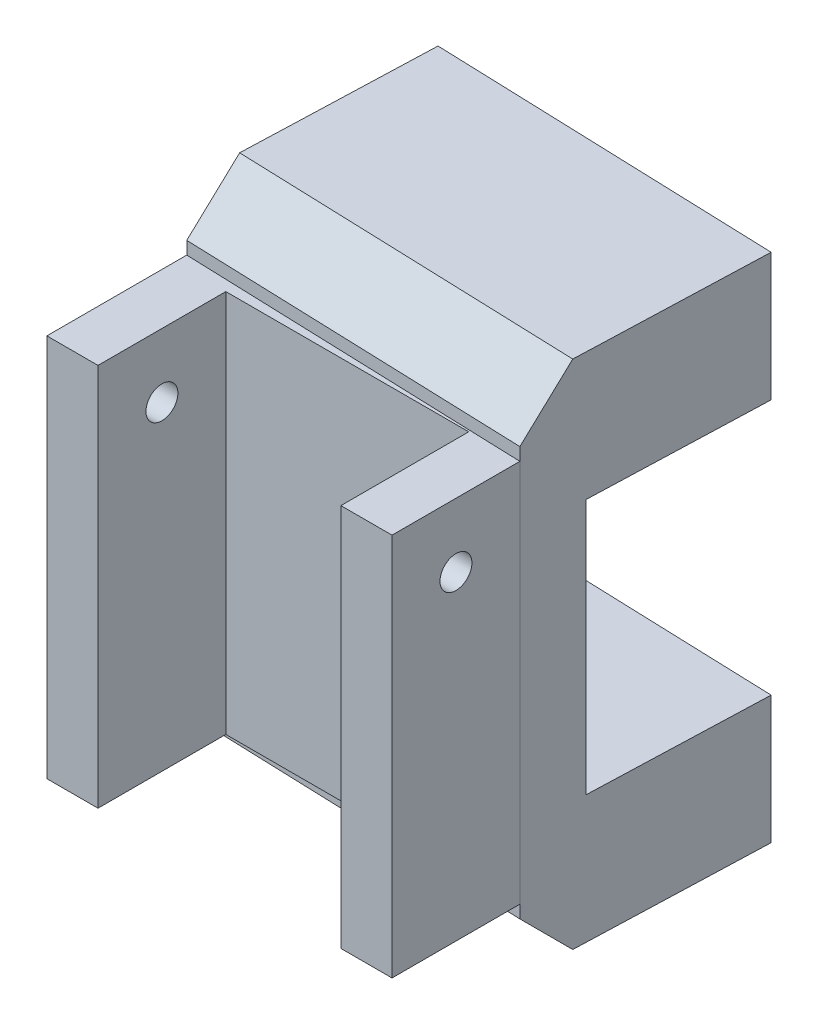
ISO-10303-21;
HEADER;
FILE_DESCRIPTION(('STEP AP214'),'2;1');
FILE_NAME('part.step','',(''),(''),'','','');
FILE_SCHEMA(('AUTOMOTIVE_DESIGN { 1 0 10303 214 1 1 1 1 }'));
ENDSEC;
DATA;
#1=APPLICATION_CONTEXT('core data for automotive mechanical design processes');
#2=APPLICATION_PROTOCOL_DEFINITION('international standard','automotive_design',2000,#1);
#3=PRODUCT_CONTEXT('',#1,'mechanical');
#4=PRODUCT('Part','Part','',(#3));
#5=PRODUCT_RELATED_PRODUCT_CATEGORY('part','',(#4));
#6=PRODUCT_DEFINITION_FORMATION('','',#4);
#7=PRODUCT_DEFINITION_CONTEXT('part definition',#1,'design');
#8=PRODUCT_DEFINITION('design','',#6,#7);
#9=PRODUCT_DEFINITION_SHAPE('','',#8);
#10=(LENGTH_UNIT() NAMED_UNIT(*) SI_UNIT(.MILLI.,.METRE.));
#11=(NAMED_UNIT(*) PLANE_ANGLE_UNIT() SI_UNIT($,.RADIAN.));
#12=(NAMED_UNIT(*) SI_UNIT($,.STERADIAN.) SOLID_ANGLE_UNIT());
#13=UNCERTAINTY_MEASURE_WITH_UNIT(LENGTH_MEASURE(1.E-05),#10,'distance_accuracy_value','');
#14=(GEOMETRIC_REPRESENTATION_CONTEXT(3) GLOBAL_UNCERTAINTY_ASSIGNED_CONTEXT((#13)) GLOBAL_UNIT_ASSIGNED_CONTEXT((#10,
#11,#12)) REPRESENTATION_CONTEXT('',''));
#15=CARTESIAN_POINT('',(0.,0.,0.));
#16=DIRECTION('',(0.,0.,1.));
#17=DIRECTION('',(1.,0.,0.));
#18=AXIS2_PLACEMENT_3D('',#15,#16,#17);
#19=CARTESIAN_POINT('',(8.68337344313627,9.525,-6.35));
#20=DIRECTION('',(-0.0348994967024937,0.,0.999390827019096));
#21=DIRECTION('',(0.999390827019096,0.,0.0348994967024937));
#22=AXIS2_PLACEMENT_3D('',#19,#20,#21);
#23=PLANE('',#22);
#24=DIRECTION('',(0.,-1.,0.));
#25=VECTOR('',#24,1.);
#26=CARTESIAN_POINT('',(8.68337344313627,9.525,-6.35));
#27=LINE('',#26,#25);
#28=CARTESIAN_POINT('',(8.68337344313627,6.35,-6.35));
#29=VERTEX_POINT('',#28);
#30=CARTESIAN_POINT('',(8.68337344313628,-6.35,-6.35));
#31=VERTEX_POINT('',#30);
#32=EDGE_CURVE('E603',#29,#31,#27,.T.);
#33=ORIENTED_EDGE('',*,*,#32,.T.);
#34=DIRECTION('',(-0.999390827019096,0.,-0.0348994967024937));
#35=VECTOR('',#34,1.);
#36=CARTESIAN_POINT('',(8.68337344313627,-6.35,-6.35));
#37=LINE('',#36,#35);
#38=CARTESIAN_POINT('',(-8.46162655686373,-6.35,-6.94871659293589));
#39=VERTEX_POINT('',#38);
#40=EDGE_CURVE('E512',#31,#39,#37,.T.);
#41=ORIENTED_EDGE('',*,*,#40,.T.);
#42=DIRECTION('',(0.,-1.,0.));
#43=VECTOR('',#42,1.);
#44=CARTESIAN_POINT('',(-8.46162655686373,9.525,-6.94871659293589));
#45=LINE('',#44,#43);
#46=CARTESIAN_POINT('',(-8.46162655686373,6.35,-6.94871659293589));
#47=VERTEX_POINT('',#46);
#48=EDGE_CURVE('E628',#47,#39,#45,.T.);
#49=ORIENTED_EDGE('',*,*,#48,.F.);
#50=DIRECTION('',(0.999390827019096,0.,0.0348994967024937));
#51=VECTOR('',#50,1.);
#52=CARTESIAN_POINT('',(8.68337344313627,6.35,-6.35));
#53=LINE('',#52,#51);
#54=EDGE_CURVE('E561',#47,#29,#53,.T.);
#55=ORIENTED_EDGE('',*,*,#54,.T.);
#56=EDGE_LOOP('',(#33,#41,#49,#55));
#57=FACE_BOUND('',#56,.T.);
#58=ADVANCED_FACE('F372',(#57),#23,.F.);
#59=CARTESIAN_POINT('',(-8.46162655686373,9.525,-6.94871659293589));
#60=DIRECTION('',(0.999390827019096,0.,0.0348994967024924));
#61=DIRECTION('',(0.0348994967024924,0.,-0.999390827019096));
#62=AXIS2_PLACEMENT_3D('',#59,#60,#61);
#63=PLANE('',#62);
#64=DIRECTION('',(0.,1.,0.));
#65=VECTOR('',#64,1.);
#66=CARTESIAN_POINT('',(-8.5725,6.35,-3.7737165929359));
#67=LINE('',#66,#65);
#68=CARTESIAN_POINT('',(-8.5725,9.525,-3.7737165929359));
#69=VERTEX_POINT('',#68);
#70=CARTESIAN_POINT('',(-8.5725,10.16,-3.7737165929359));
#71=VERTEX_POINT('',#70);
#72=EDGE_CURVE('E538',#69,#71,#67,.T.);
#73=ORIENTED_EDGE('',*,*,#72,.T.);
#74=DIRECTION('',(-0.0246776707783299,-0.707106781186548,0.706676030840834));
#75=VECTOR('',#74,1.);
#76=CARTESIAN_POINT('',(-8.48385527837567,12.7,-6.31216929356442));
#77=LINE('',#76,#75);
#78=CARTESIAN_POINT('',(-8.48385527837567,12.7,-6.3121692935644));
#79=VERTEX_POINT('',#78);
#80=EDGE_CURVE('E649',#71,#79,#77,.F.);
#81=ORIENTED_EDGE('',*,*,#80,.T.);
#82=DIRECTION('',(0.0348994967024924,0.,-0.999390827019096));
#83=VECTOR('',#82,1.);
#84=CARTESIAN_POINT('',(-8.15137003117857,12.7,-15.8333010451357));
#85=LINE('',#84,#83);
#86=CARTESIAN_POINT('',(-8.15137003117857,12.7,-15.8333010451357));
#87=VERTEX_POINT('',#86);
#88=EDGE_CURVE('E547',#79,#87,#85,.T.);
#89=ORIENTED_EDGE('',*,*,#88,.T.);
#90=DIRECTION('',(0.,-1.,0.));
#91=VECTOR('',#90,1.);
#92=CARTESIAN_POINT('',(-8.15137003117857,12.7,-15.8333010451357));
#93=LINE('',#92,#91);
#94=CARTESIAN_POINT('',(-8.15137003117857,6.35,-15.8333010451357));
#95=VERTEX_POINT('',#94);
#96=EDGE_CURVE('E545',#87,#95,#93,.T.);
#97=ORIENTED_EDGE('',*,*,#96,.T.);
#98=DIRECTION('',(-0.0348994967024924,0.,0.999390827019096));
#99=VECTOR('',#98,1.);
#100=CARTESIAN_POINT('',(-8.15137003117857,6.35,-15.8333010451357));
#101=LINE('',#100,#99);
#102=EDGE_CURVE('E541',#95,#47,#101,.T.);
#103=ORIENTED_EDGE('',*,*,#102,.T.);
#104=ORIENTED_EDGE('',*,*,#48,.T.);
#105=DIRECTION('',(0.0348994967024924,0.,-0.999390827019096));
#106=VECTOR('',#105,1.);
#107=CARTESIAN_POINT('',(-8.15137003117857,-6.35,-15.8333010451357));
#108=LINE('',#107,#106);
#109=CARTESIAN_POINT('',(-8.15137003117857,-6.35,-15.8333010451357));
#110=VERTEX_POINT('',#109);
#111=EDGE_CURVE('E534',#39,#110,#108,.T.);
#112=ORIENTED_EDGE('',*,*,#111,.T.);
#113=DIRECTION('',(0.,-1.,0.));
#114=VECTOR('',#113,1.);
#115=CARTESIAN_POINT('',(-8.15137003117857,-6.35,-15.8333010451357));
#116=LINE('',#115,#114);
#117=CARTESIAN_POINT('',(-8.15137003117857,-12.7,-15.8333010451357));
#118=VERTEX_POINT('',#117);
#119=EDGE_CURVE('E503',#110,#118,#116,.T.);
#120=ORIENTED_EDGE('',*,*,#119,.T.);
#121=DIRECTION('',(-0.0348994967024924,0.,0.999390827019096));
#122=VECTOR('',#121,1.);
#123=CARTESIAN_POINT('',(-8.15137003117857,-12.7,-15.8333010451357));
#124=LINE('',#123,#122);
#125=CARTESIAN_POINT('',(-8.48385527837567,-12.7,-6.31216929356441));
#126=VERTEX_POINT('',#125);
#127=EDGE_CURVE('E740',#118,#126,#124,.T.);
#128=ORIENTED_EDGE('',*,*,#127,.T.);
#129=DIRECTION('',(0.0246776707783299,-0.707106781186546,-0.706676030840836));
#130=VECTOR('',#129,1.);
#131=CARTESIAN_POINT('',(-8.5725,-10.16,-3.77371659293591));
#132=LINE('',#131,#130);
#133=CARTESIAN_POINT('',(-8.5725,-10.16,-3.7737165929359));
#134=VERTEX_POINT('',#133);
#135=EDGE_CURVE('E386',#126,#134,#132,.F.);
#136=ORIENTED_EDGE('',*,*,#135,.T.);
#137=DIRECTION('',(0.,1.,0.));
#138=VECTOR('',#137,1.);
#139=CARTESIAN_POINT('',(-8.5725,-9.525,-3.7737165929359));
#140=LINE('',#139,#138);
#141=CARTESIAN_POINT('',(-8.5725,-9.525,-3.77371659293589));
#142=VERTEX_POINT('',#141);
#143=EDGE_CURVE('E532',#134,#142,#140,.T.);
#144=ORIENTED_EDGE('',*,*,#143,.T.);
#145=DIRECTION('',(0.,-1.,0.));
#146=VECTOR('',#145,1.);
#147=CARTESIAN_POINT('',(-8.5725,9.525,-3.77371659293589));
#148=LINE('',#147,#146);
#149=EDGE_CURVE('E625',#69,#142,#148,.T.);
#150=ORIENTED_EDGE('',*,*,#149,.F.);
#151=EDGE_LOOP('',(#73,#81,#89,#97,#103,#104,#112,#120,#128,#136,#144,#150));
#152=FACE_BOUND('',#151,.T.);
#153=ADVANCED_FACE('F714',(#152),#63,.F.);
#154=CARTESIAN_POINT('',(-8.5725,9.525,-3.77371659293589));
#155=DIRECTION('',(1.,0.,0.));
#156=DIRECTION('',(0.,0.,-1.));
#157=AXIS2_PLACEMENT_3D('',#154,#155,#156);
#158=PLANE('',#157);
#159=CARTESIAN_POINT('',(-8.5725,6.35,0.));
#160=DIRECTION('',(-1.,0.,0.));
#161=DIRECTION('',(0.,0.,1.));
#162=AXIS2_PLACEMENT_3D('',#159,#160,#161);
#163=CIRCLE('',#162,0.79375);
#164=CARTESIAN_POINT('',(-8.5725,6.35,0.79375));
#165=VERTEX_POINT('',#164);
#166=EDGE_CURVE('E563',#165,#165,#163,.T.);
#167=ORIENTED_EDGE('',*,*,#166,.F.);
#168=EDGE_LOOP('',(#167));
#169=FACE_BOUND('',#168,.T.);
#170=DIRECTION('',(0.,0.,1.));
#171=VECTOR('',#170,1.);
#172=CARTESIAN_POINT('',(-8.5725,-9.525,-3.77371659293589));
#173=LINE('',#172,#171);
#174=CARTESIAN_POINT('',(-8.5725,-9.525,3.175));
#175=VERTEX_POINT('',#174);
#176=EDGE_CURVE('E573',#142,#175,#173,.T.);
#177=ORIENTED_EDGE('',*,*,#176,.T.);
#178=DIRECTION('',(0.,-1.,0.));
#179=VECTOR('',#178,1.);
#180=CARTESIAN_POINT('',(-8.5725,9.525,3.175));
#181=LINE('',#180,#179);
#182=CARTESIAN_POINT('',(-8.5725,9.525,3.175));
#183=VERTEX_POINT('',#182);
#184=EDGE_CURVE('E622',#183,#175,#181,.T.);
#185=ORIENTED_EDGE('',*,*,#184,.F.);
#186=DIRECTION('',(0.,0.,1.));
#187=VECTOR('',#186,1.);
#188=CARTESIAN_POINT('',(-8.5725,9.525,-3.77371659293589));
#189=LINE('',#188,#187);
#190=EDGE_CURVE('E588',#69,#183,#189,.T.);
#191=ORIENTED_EDGE('',*,*,#190,.F.);
#192=ORIENTED_EDGE('',*,*,#149,.T.);
#193=EDGE_LOOP('',(#177,#185,#191,#192));
#194=FACE_BOUND('',#193,.T.);
#195=ADVANCED_FACE('F685',(#169,#194),#158,.F.);
#196=CARTESIAN_POINT('',(-8.5725,9.525,3.175));
#197=DIRECTION('',(0.,0.,-1.));
#198=DIRECTION('',(-1.,0.,0.));
#199=AXIS2_PLACEMENT_3D('',#196,#197,#198);
#200=PLANE('',#199);
#201=DIRECTION('',(1.,0.,0.));
#202=VECTOR('',#201,1.);
#203=CARTESIAN_POINT('',(-8.5725,-9.525,3.175));
#204=LINE('',#203,#202);
#205=CARTESIAN_POINT('',(-6.0325,-9.525,3.175));
#206=VERTEX_POINT('',#205);
#207=EDGE_CURVE('E575',#175,#206,#204,.T.);
#208=ORIENTED_EDGE('',*,*,#207,.T.);
#209=DIRECTION('',(0.,-1.,0.));
#210=VECTOR('',#209,1.);
#211=CARTESIAN_POINT('',(-6.0325,9.525,3.175));
#212=LINE('',#211,#210);
#213=CARTESIAN_POINT('',(-6.0325,9.525,3.175));
#214=VERTEX_POINT('',#213);
#215=EDGE_CURVE('E619',#214,#206,#212,.T.);
#216=ORIENTED_EDGE('',*,*,#215,.F.);
#217=DIRECTION('',(1.,0.,0.));
#218=VECTOR('',#217,1.);
#219=CARTESIAN_POINT('',(-8.5725,9.525,3.175));
#220=LINE('',#219,#218);
#221=EDGE_CURVE('E590',#183,#214,#220,.T.);
#222=ORIENTED_EDGE('',*,*,#221,.F.);
#223=ORIENTED_EDGE('',*,*,#184,.T.);
#224=EDGE_LOOP('',(#208,#216,#222,#223));
#225=FACE_BOUND('',#224,.T.);
#226=ADVANCED_FACE('F689',(#225),#200,.F.);
#227=CARTESIAN_POINT('',(-6.0325,9.525,3.175));
#228=DIRECTION('',(-1.,0.,0.));
#229=DIRECTION('',(0.,0.,1.));
#230=AXIS2_PLACEMENT_3D('',#227,#228,#229);
#231=PLANE('',#230);
#232=CARTESIAN_POINT('',(-6.0325,6.35,0.));
#233=DIRECTION('',(-1.,0.,0.));
#234=DIRECTION('',(0.,0.,1.));
#235=AXIS2_PLACEMENT_3D('',#232,#233,#234);
#236=CIRCLE('',#235,0.79375);
#237=CARTESIAN_POINT('',(-6.0325,6.35,0.793750000000001));
#238=VERTEX_POINT('',#237);
#239=EDGE_CURVE('E570',#238,#238,#236,.T.);
#240=ORIENTED_EDGE('',*,*,#239,.T.);
#241=EDGE_LOOP('',(#240));
#242=FACE_BOUND('',#241,.T.);
#243=DIRECTION('',(0.,0.,-1.));
#244=VECTOR('',#243,1.);
#245=CARTESIAN_POINT('',(-6.0325,-9.525,3.175));
#246=LINE('',#245,#244);
#247=CARTESIAN_POINT('',(-6.0325,-9.525,-3.175));
#248=VERTEX_POINT('',#247);
#249=EDGE_CURVE('E577',#206,#248,#246,.T.);
#250=ORIENTED_EDGE('',*,*,#249,.T.);
#251=DIRECTION('',(0.,-1.,0.));
#252=VECTOR('',#251,1.);
#253=CARTESIAN_POINT('',(-6.0325,9.525,-3.175));
#254=LINE('',#253,#252);
#255=CARTESIAN_POINT('',(-6.0325,9.525,-3.175));
#256=VERTEX_POINT('',#255);
#257=EDGE_CURVE('E616',#256,#248,#254,.T.);
#258=ORIENTED_EDGE('',*,*,#257,.F.);
#259=DIRECTION('',(0.,0.,-1.));
#260=VECTOR('',#259,1.);
#261=CARTESIAN_POINT('',(-6.0325,9.525,3.175));
#262=LINE('',#261,#260);
#263=EDGE_CURVE('E592',#214,#256,#262,.T.);
#264=ORIENTED_EDGE('',*,*,#263,.F.);
#265=ORIENTED_EDGE('',*,*,#215,.T.);
#266=EDGE_LOOP('',(#250,#258,#264,#265));
#267=FACE_BOUND('',#266,.T.);
#268=ADVANCED_FACE('F696',(#242,#267),#231,.F.);
#269=CARTESIAN_POINT('',(-6.0325,9.525,-3.175));
#270=DIRECTION('',(0.,0.,-1.));
#271=DIRECTION('',(-1.,0.,0.));
#272=AXIS2_PLACEMENT_3D('',#269,#270,#271);
#273=PLANE('',#272);
#274=DIRECTION('',(1.,0.,0.));
#275=VECTOR('',#274,1.);
#276=CARTESIAN_POINT('',(-6.0325,-9.525,-3.175));
#277=LINE('',#276,#275);
#278=CARTESIAN_POINT('',(6.0325,-9.525,-3.175));
#279=VERTEX_POINT('',#278);
#280=EDGE_CURVE('E579',#248,#279,#277,.T.);
#281=ORIENTED_EDGE('',*,*,#280,.T.);
#282=DIRECTION('',(0.,-1.,0.));
#283=VECTOR('',#282,1.);
#284=CARTESIAN_POINT('',(6.0325,9.525,-3.175));
#285=LINE('',#284,#283);
#286=CARTESIAN_POINT('',(6.0325,9.525,-3.175));
#287=VERTEX_POINT('',#286);
#288=EDGE_CURVE('E613',#287,#279,#285,.T.);
#289=ORIENTED_EDGE('',*,*,#288,.F.);
#290=DIRECTION('',(1.,0.,0.));
#291=VECTOR('',#290,1.);
#292=CARTESIAN_POINT('',(-6.0325,9.525,-3.175));
#293=LINE('',#292,#291);
#294=EDGE_CURVE('E594',#256,#287,#293,.T.);
#295=ORIENTED_EDGE('',*,*,#294,.F.);
#296=ORIENTED_EDGE('',*,*,#257,.T.);
#297=EDGE_LOOP('',(#281,#289,#295,#296));
#298=FACE_BOUND('',#297,.T.);
#299=ADVANCED_FACE('F699',(#298),#273,.F.);
#300=CARTESIAN_POINT('',(6.0325,9.525,-3.175));
#301=DIRECTION('',(1.,0.,0.));
#302=DIRECTION('',(0.,0.,-1.));
#303=AXIS2_PLACEMENT_3D('',#300,#301,#302);
#304=PLANE('',#303);
#305=CARTESIAN_POINT('',(6.0325,6.35,0.));
#306=DIRECTION('',(1.,0.,0.));
#307=DIRECTION('',(0.,0.,-1.));
#308=AXIS2_PLACEMENT_3D('',#305,#306,#307);
#309=CIRCLE('',#308,0.79375);
#310=CARTESIAN_POINT('',(6.0325,6.35,0.793750000000004));
#311=VERTEX_POINT('',#310);
#312=EDGE_CURVE('E567',#311,#311,#309,.T.);
#313=ORIENTED_EDGE('',*,*,#312,.T.);
#314=EDGE_LOOP('',(#313));
#315=FACE_BOUND('',#314,.T.);
#316=DIRECTION('',(0.,0.,1.));
#317=VECTOR('',#316,1.);
#318=CARTESIAN_POINT('',(6.0325,-9.525,-3.175));
#319=LINE('',#318,#317);
#320=CARTESIAN_POINT('',(6.0325,-9.525,3.175));
#321=VERTEX_POINT('',#320);
#322=EDGE_CURVE('E581',#279,#321,#319,.T.);
#323=ORIENTED_EDGE('',*,*,#322,.T.);
#324=DIRECTION('',(0.,-1.,0.));
#325=VECTOR('',#324,1.);
#326=CARTESIAN_POINT('',(6.0325,9.525,3.175));
#327=LINE('',#326,#325);
#328=CARTESIAN_POINT('',(6.0325,9.525,3.175));
#329=VERTEX_POINT('',#328);
#330=EDGE_CURVE('E610',#329,#321,#327,.T.);
#331=ORIENTED_EDGE('',*,*,#330,.F.);
#332=DIRECTION('',(0.,0.,1.));
#333=VECTOR('',#332,1.);
#334=CARTESIAN_POINT('',(6.0325,9.525,-3.175));
#335=LINE('',#334,#333);
#336=EDGE_CURVE('E596',#287,#329,#335,.T.);
#337=ORIENTED_EDGE('',*,*,#336,.F.);
#338=ORIENTED_EDGE('',*,*,#288,.T.);
#339=EDGE_LOOP('',(#323,#331,#337,#338));
#340=FACE_BOUND('',#339,.T.);
#341=ADVANCED_FACE('F701',(#315,#340),#304,.F.);
#342=CARTESIAN_POINT('',(6.0325,9.525,3.175));
#343=DIRECTION('',(0.,0.,-1.));
#344=DIRECTION('',(-1.,0.,0.));
#345=AXIS2_PLACEMENT_3D('',#342,#343,#344);
#346=PLANE('',#345);
#347=DIRECTION('',(1.,0.,0.));
#348=VECTOR('',#347,1.);
#349=CARTESIAN_POINT('',(6.0325,-9.525,3.175));
#350=LINE('',#349,#348);
#351=CARTESIAN_POINT('',(8.5725,-9.525,3.175));
#352=VERTEX_POINT('',#351);
#353=EDGE_CURVE('E583',#321,#352,#350,.T.);
#354=ORIENTED_EDGE('',*,*,#353,.T.);
#355=DIRECTION('',(0.,-1.,0.));
#356=VECTOR('',#355,1.);
#357=CARTESIAN_POINT('',(8.5725,9.525,3.175));
#358=LINE('',#357,#356);
#359=CARTESIAN_POINT('',(8.5725,9.525,3.175));
#360=VERTEX_POINT('',#359);
#361=EDGE_CURVE('E607',#360,#352,#358,.T.);
#362=ORIENTED_EDGE('',*,*,#361,.F.);
#363=DIRECTION('',(1.,0.,0.));
#364=VECTOR('',#363,1.);
#365=CARTESIAN_POINT('',(6.0325,9.525,3.175));
#366=LINE('',#365,#364);
#367=EDGE_CURVE('E598',#329,#360,#366,.T.);
#368=ORIENTED_EDGE('',*,*,#367,.F.);
#369=ORIENTED_EDGE('',*,*,#330,.T.);
#370=EDGE_LOOP('',(#354,#362,#368,#369));
#371=FACE_BOUND('',#370,.T.);
#372=ADVANCED_FACE('F676',(#371),#346,.F.);
#373=CARTESIAN_POINT('',(8.5725,9.525,3.175));
#374=DIRECTION('',(-1.,0.,0.));
#375=DIRECTION('',(0.,0.,1.));
#376=AXIS2_PLACEMENT_3D('',#373,#374,#375);
#377=PLANE('',#376);
#378=CARTESIAN_POINT('',(8.5725,6.35,0.));
#379=DIRECTION('',(-1.,0.,0.));
#380=DIRECTION('',(0.,0.,1.));
#381=AXIS2_PLACEMENT_3D('',#378,#379,#380);
#382=CIRCLE('',#381,0.79375);
#383=CARTESIAN_POINT('',(8.5725,6.35,0.793750000000005));
#384=VERTEX_POINT('',#383);
#385=EDGE_CURVE('E566',#384,#384,#382,.T.);
#386=ORIENTED_EDGE('',*,*,#385,.T.);
#387=EDGE_LOOP('',(#386));
#388=FACE_BOUND('',#387,.T.);
#389=DIRECTION('',(0.,0.,-1.));
#390=VECTOR('',#389,1.);
#391=CARTESIAN_POINT('',(8.5725,-9.525,3.175));
#392=LINE('',#391,#390);
#393=CARTESIAN_POINT('',(8.57250000000001,-9.525,-3.175));
#394=VERTEX_POINT('',#393);
#395=EDGE_CURVE('E585',#352,#394,#392,.T.);
#396=ORIENTED_EDGE('',*,*,#395,.T.);
#397=DIRECTION('',(0.,-1.,0.));
#398=VECTOR('',#397,1.);
#399=CARTESIAN_POINT('',(8.5725,9.525,-3.175));
#400=LINE('',#399,#398);
#401=CARTESIAN_POINT('',(8.5725,9.525,-3.175));
#402=VERTEX_POINT('',#401);
#403=EDGE_CURVE('E605',#402,#394,#400,.T.);
#404=ORIENTED_EDGE('',*,*,#403,.F.);
#405=DIRECTION('',(0.,0.,-1.));
#406=VECTOR('',#405,1.);
#407=CARTESIAN_POINT('',(8.5725,9.525,3.175));
#408=LINE('',#407,#406);
#409=EDGE_CURVE('E600',#360,#402,#408,.T.);
#410=ORIENTED_EDGE('',*,*,#409,.F.);
#411=ORIENTED_EDGE('',*,*,#361,.T.);
#412=EDGE_LOOP('',(#396,#404,#410,#411));
#413=FACE_BOUND('',#412,.T.);
#414=ADVANCED_FACE('F662',(#388,#413),#377,.F.);
#415=CARTESIAN_POINT('',(8.5725,9.525,-3.175));
#416=DIRECTION('',(-0.999390827019096,0.,-0.0348994967024935));
#417=DIRECTION('',(-0.0348994967024935,0.,0.999390827019096));
#418=AXIS2_PLACEMENT_3D('',#415,#416,#417);
#419=PLANE('',#418);
#420=DIRECTION('',(-0.0348994967024942,0.,0.999390827019096));
#421=VECTOR('',#420,1.);
#422=CARTESIAN_POINT('',(8.99362996882146,12.7,-15.2345844521998));
#423=LINE('',#422,#421);
#424=CARTESIAN_POINT('',(8.99362996882146,12.7,-15.2345844521998));
#425=VERTEX_POINT('',#424);
#426=CARTESIAN_POINT('',(8.66114472162434,12.7,-5.7134527006285));
#427=VERTEX_POINT('',#426);
#428=EDGE_CURVE('E550',#425,#427,#423,.T.);
#429=ORIENTED_EDGE('',*,*,#428,.T.);
#430=DIRECTION('',(0.0246776707783306,0.707106781186548,-0.706676030840834));
#431=VECTOR('',#430,1.);
#432=CARTESIAN_POINT('',(8.66114472162433,12.7,-5.71345270062852));
#433=LINE('',#432,#431);
#434=CARTESIAN_POINT('',(8.57250000000001,10.16,-3.175));
#435=VERTEX_POINT('',#434);
#436=EDGE_CURVE('E644',#427,#435,#433,.F.);
#437=ORIENTED_EDGE('',*,*,#436,.T.);
#438=DIRECTION('',(0.,-1.,0.));
#439=VECTOR('',#438,1.);
#440=CARTESIAN_POINT('',(8.57250000000001,6.35,-3.175));
#441=LINE('',#440,#439);
#442=EDGE_CURVE('E552',#435,#402,#441,.T.);
#443=ORIENTED_EDGE('',*,*,#442,.T.);
#444=ORIENTED_EDGE('',*,*,#403,.T.);
#445=DIRECTION('',(0.,-1.,0.));
#446=VECTOR('',#445,1.);
#447=CARTESIAN_POINT('',(8.57250000000001,-9.525,-3.175));
#448=LINE('',#447,#446);
#449=CARTESIAN_POINT('',(8.5725,-10.16,-3.175));
#450=VERTEX_POINT('',#449);
#451=EDGE_CURVE('E516',#394,#450,#448,.T.);
#452=ORIENTED_EDGE('',*,*,#451,.T.);
#453=DIRECTION('',(-0.0246776707783307,0.707106781186546,0.706676030840836));
#454=VECTOR('',#453,1.);
#455=CARTESIAN_POINT('',(8.5725,-10.16,-3.17500000000001));
#456=LINE('',#455,#454);
#457=CARTESIAN_POINT('',(8.66114472162434,-12.7,-5.71345270062851));
#458=VERTEX_POINT('',#457);
#459=EDGE_CURVE('E642',#450,#458,#456,.F.);
#460=ORIENTED_EDGE('',*,*,#459,.T.);
#461=DIRECTION('',(0.0348994967024942,0.,-0.999390827019096));
#462=VECTOR('',#461,1.);
#463=CARTESIAN_POINT('',(8.99362996882146,-12.7,-15.2345844521998));
#464=LINE('',#463,#462);
#465=CARTESIAN_POINT('',(8.99362996882146,-12.7,-15.2345844521998));
#466=VERTEX_POINT('',#465);
#467=EDGE_CURVE('E506',#458,#466,#464,.T.);
#468=ORIENTED_EDGE('',*,*,#467,.T.);
#469=DIRECTION('',(0.,1.,0.));
#470=VECTOR('',#469,1.);
#471=CARTESIAN_POINT('',(8.99362996882146,-6.35,-15.2345844521998));
#472=LINE('',#471,#470);
#473=CARTESIAN_POINT('',(8.99362996882146,-6.35,-15.2345844521998));
#474=VERTEX_POINT('',#473);
#475=EDGE_CURVE('E502',#466,#474,#472,.T.);
#476=ORIENTED_EDGE('',*,*,#475,.T.);
#477=DIRECTION('',(-0.0348994967024942,0.,0.999390827019096));
#478=VECTOR('',#477,1.);
#479=CARTESIAN_POINT('',(8.99362996882146,-6.35,-15.2345844521998));
#480=LINE('',#479,#478);
#481=EDGE_CURVE('E509',#474,#31,#480,.T.);
#482=ORIENTED_EDGE('',*,*,#481,.T.);
#483=ORIENTED_EDGE('',*,*,#32,.F.);
#484=DIRECTION('',(0.0348994967024942,0.,-0.999390827019096));
#485=VECTOR('',#484,1.);
#486=CARTESIAN_POINT('',(8.99362996882146,6.35,-15.2345844521998));
#487=LINE('',#486,#485);
#488=CARTESIAN_POINT('',(8.99362996882146,6.35,-15.2345844521998));
#489=VERTEX_POINT('',#488);
#490=EDGE_CURVE('E554',#29,#489,#487,.T.);
#491=ORIENTED_EDGE('',*,*,#490,.T.);
#492=DIRECTION('',(0.,1.,0.));
#493=VECTOR('',#492,1.);
#494=CARTESIAN_POINT('',(8.99362996882146,12.7,-15.2345844521998));
#495=LINE('',#494,#493);
#496=EDGE_CURVE('E537',#489,#425,#495,.T.);
#497=ORIENTED_EDGE('',*,*,#496,.T.);
#498=EDGE_LOOP('',(#429,#437,#443,#444,#452,#460,#468,#476,#482,#483,#491,#497));
#499=FACE_BOUND('',#498,.T.);
#500=ADVANCED_FACE('F519',(#499),#419,.F.);
#501=CARTESIAN_POINT('',(8.68337344313627,9.525,-6.35));
#502=DIRECTION('',(0.,-1.,0.));
#503=DIRECTION('',(0.,0.,-1.));
#504=AXIS2_PLACEMENT_3D('',#501,#502,#503);
#505=PLANE('',#504);
#506=ORIENTED_EDGE('',*,*,#409,.T.);
#507=DIRECTION('',(-0.999390827019096,0.,-0.0348994967024943));
#508=VECTOR('',#507,1.);
#509=CARTESIAN_POINT('',(8.57249999999999,9.525,-3.175));
#510=LINE('',#509,#508);
#511=EDGE_CURVE('E631',#402,#69,#510,.T.);
#512=ORIENTED_EDGE('',*,*,#511,.T.);
#513=ORIENTED_EDGE('',*,*,#190,.T.);
#514=ORIENTED_EDGE('',*,*,#221,.T.);
#515=ORIENTED_EDGE('',*,*,#263,.T.);
#516=ORIENTED_EDGE('',*,*,#294,.T.);
#517=ORIENTED_EDGE('',*,*,#336,.T.);
#518=ORIENTED_EDGE('',*,*,#367,.T.);
#519=EDGE_LOOP('',(#506,#512,#513,#514,#515,#516,#517,#518));
#520=FACE_BOUND('',#519,.T.);
#521=ADVANCED_FACE('F669',(#520),#505,.F.);
#522=CARTESIAN_POINT('',(8.68337344313627,-9.525,-6.35));
#523=DIRECTION('',(0.,-1.,0.));
#524=DIRECTION('',(0.,0.,-1.));
#525=AXIS2_PLACEMENT_3D('',#522,#523,#524);
#526=PLANE('',#525);
#527=DIRECTION('',(-0.999390827019096,0.,-0.0348994967024943));
#528=VECTOR('',#527,1.);
#529=CARTESIAN_POINT('',(8.57249999999999,-9.525,-3.175));
#530=LINE('',#529,#528);
#531=EDGE_CURVE('E636',#394,#142,#530,.T.);
#532=ORIENTED_EDGE('',*,*,#531,.F.);
#533=ORIENTED_EDGE('',*,*,#395,.F.);
#534=ORIENTED_EDGE('',*,*,#353,.F.);
#535=ORIENTED_EDGE('',*,*,#322,.F.);
#536=ORIENTED_EDGE('',*,*,#280,.F.);
#537=ORIENTED_EDGE('',*,*,#249,.F.);
#538=ORIENTED_EDGE('',*,*,#207,.F.);
#539=ORIENTED_EDGE('',*,*,#176,.F.);
#540=EDGE_LOOP('',(#532,#533,#534,#535,#536,#537,#538,#539));
#541=FACE_BOUND('',#540,.T.);
#542=ADVANCED_FACE('F679',(#541),#526,.T.);
#543=CARTESIAN_POINT('',(8.68337344313627,6.35,0.));
#544=DIRECTION('',(-1.,0.,0.));
#545=DIRECTION('',(0.,0.,1.));
#546=AXIS2_PLACEMENT_3D('',#543,#544,#545);
#547=CYLINDRICAL_SURFACE('',#546,0.79375);
#548=CARTESIAN_POINT('',(8.5725,6.35,0.793750000000005));
#549=CARTESIAN_POINT('',(8.54604166666667,6.35,0.793750000000005));
#550=CARTESIAN_POINT('',(8.51958333333333,6.35,0.793750000000005));
#551=CARTESIAN_POINT('',(8.46666666666667,6.35,0.793750000000005));
#552=CARTESIAN_POINT('',(8.44020833333333,6.35,0.793750000000005));
#553=CARTESIAN_POINT('',(8.38729166666667,6.35,0.793750000000005));
#554=CARTESIAN_POINT('',(8.36083333333333,6.35,0.793750000000005));
#555=CARTESIAN_POINT('',(8.30791666666667,6.35,0.793750000000005));
#556=CARTESIAN_POINT('',(8.28145833333333,6.35,0.793750000000005));
#557=CARTESIAN_POINT('',(8.22854166666666,6.35,0.793750000000005));
#558=CARTESIAN_POINT('',(8.20208333333333,6.35,0.793750000000005));
#559=CARTESIAN_POINT('',(8.14916666666667,6.35,0.793750000000005));
#560=CARTESIAN_POINT('',(8.12270833333333,6.35,0.793750000000005));
#561=CARTESIAN_POINT('',(8.06979166666667,6.35,0.793750000000005));
#562=CARTESIAN_POINT('',(8.04333333333333,6.35,0.793750000000005));
#563=CARTESIAN_POINT('',(7.99041666666667,6.35,0.793750000000005));
#564=CARTESIAN_POINT('',(7.96395833333333,6.35,0.793750000000005));
#565=CARTESIAN_POINT('',(7.91104166666667,6.35,0.793750000000005));
#566=CARTESIAN_POINT('',(7.88458333333333,6.35,0.793750000000005));
#567=CARTESIAN_POINT('',(7.83166666666667,6.35,0.793750000000005));
#568=CARTESIAN_POINT('',(7.80520833333333,6.35,0.793750000000005));
#569=CARTESIAN_POINT('',(7.75229166666667,6.35,0.793750000000005));
#570=CARTESIAN_POINT('',(7.72583333333333,6.35,0.793750000000005));
#571=CARTESIAN_POINT('',(7.67291666666667,6.35,0.793750000000005));
#572=CARTESIAN_POINT('',(7.64645833333333,6.35,0.793750000000005));
#573=CARTESIAN_POINT('',(7.59354166666667,6.35,0.793750000000005));
#574=CARTESIAN_POINT('',(7.56708333333333,6.35,0.793750000000005));
#575=CARTESIAN_POINT('',(7.51416666666667,6.35,0.793750000000005));
#576=CARTESIAN_POINT('',(7.48770833333333,6.35,0.793750000000005));
#577=CARTESIAN_POINT('',(7.43479166666667,6.35,0.793750000000005));
#578=CARTESIAN_POINT('',(7.40833333333333,6.35,0.793750000000005));
#579=CARTESIAN_POINT('',(7.35541666666667,6.35,0.793750000000005));
#580=CARTESIAN_POINT('',(7.32895833333333,6.35,0.793750000000005));
#581=CARTESIAN_POINT('',(7.27604166666667,6.35,0.793750000000005));
#582=CARTESIAN_POINT('',(7.24958333333333,6.35,0.793750000000005));
#583=CARTESIAN_POINT('',(7.19666666666667,6.35,0.793750000000005));
#584=CARTESIAN_POINT('',(7.17020833333333,6.35,0.793750000000005));
#585=CARTESIAN_POINT('',(7.11729166666667,6.35,0.793750000000005));
#586=CARTESIAN_POINT('',(7.09083333333333,6.35,0.793750000000004));
#587=CARTESIAN_POINT('',(7.03791666666667,6.35,0.793750000000004));
#588=CARTESIAN_POINT('',(7.01145833333333,6.35,0.793750000000004));
#589=CARTESIAN_POINT('',(6.95854166666667,6.35,0.793750000000004));
#590=CARTESIAN_POINT('',(6.93208333333333,6.35,0.793750000000004));
#591=CARTESIAN_POINT('',(6.87916666666667,6.35,0.793750000000004));
#592=CARTESIAN_POINT('',(6.85270833333333,6.35,0.793750000000004));
#593=CARTESIAN_POINT('',(6.79979166666667,6.35,0.793750000000004));
#594=CARTESIAN_POINT('',(6.77333333333333,6.35,0.793750000000004));
#595=CARTESIAN_POINT('',(6.72041666666667,6.35,0.793750000000004));
#596=CARTESIAN_POINT('',(6.69395833333333,6.35,0.793750000000004));
#597=CARTESIAN_POINT('',(6.64104166666667,6.35,0.793750000000004));
#598=CARTESIAN_POINT('',(6.61458333333333,6.35,0.793750000000004));
#599=CARTESIAN_POINT('',(6.56166666666667,6.35,0.793750000000004));
#600=CARTESIAN_POINT('',(6.53520833333333,6.35,0.793750000000004));
#601=CARTESIAN_POINT('',(6.48229166666667,6.35,0.793750000000004));
#602=CARTESIAN_POINT('',(6.45583333333333,6.35,0.793750000000004));
#603=CARTESIAN_POINT('',(6.40291666666667,6.35,0.793750000000004));
#604=CARTESIAN_POINT('',(6.37645833333333,6.35,0.793750000000004));
#605=CARTESIAN_POINT('',(6.32354166666667,6.35,0.793750000000004));
#606=CARTESIAN_POINT('',(6.29708333333333,6.35,0.793750000000004));
#607=CARTESIAN_POINT('',(6.24416666666666,6.35,0.793750000000004));
#608=CARTESIAN_POINT('',(6.21770833333333,6.35,0.793750000000004));
#609=CARTESIAN_POINT('',(6.16479166666667,6.35,0.793750000000004));
#610=CARTESIAN_POINT('',(6.13833333333333,6.35,0.793750000000004));
#611=CARTESIAN_POINT('',(6.08541666666667,6.35,0.793750000000004));
#612=CARTESIAN_POINT('',(6.05895833333333,6.35,0.793750000000004));
#613=CARTESIAN_POINT('',(6.0325,6.35,0.793750000000004));
#614=B_SPLINE_CURVE_WITH_KNOTS('',3,(#548,#549,#550,#551,#552,#553,#554,#555,#556,#557,#558,
#559,#560,#561,#562,#563,#564,#565,#566,#567,#568,#569,#570,#571,#572,#573,#574,#575,#576,#577,
#578,#579,#580,#581,#582,#583,#584,#585,#586,#587,#588,#589,#590,#591,#592,#593,#594,#595,#596,
#597,#598,#599,#600,#601,#602,#603,#604,#605,#606,#607,#608,#609,#610,#611,#612,#613),
.UNSPECIFIED.,.F.,.F.,(4,2,2,2,2,2,2,2,2,2,2,2,2,2,2,2,2,2,2,2,2,2,2,2,2,2,2,2,2,2,2,2,4),(0.,
0.0793750000000013,0.158750000000001,0.238125,0.317500000000002,0.396875000000001,
0.476250000000001,0.555625000000001,0.635,0.714375000000001,0.793750000000001,0.873125000000001,
0.952500000000001,1.031875,1.11125,1.190625,1.27,1.349375,1.42875,1.508125,1.5875,1.666875,
1.74625,1.825625,1.905,1.984375,2.06375,2.143125,2.2225,2.301875,2.38125,2.460625,2.54),.UNSPECIFIED.);
#615=EDGE_CURVE('BSEAM818',#384,#311,#614,.T.);
#616=ORIENTED_EDGE('',*,*,#385,.F.);
#617=ORIENTED_EDGE('',*,*,#312,.F.);
#618=ORIENTED_EDGE('',*,*,#615,.T.);
#619=ORIENTED_EDGE('',*,*,#615,.F.);
#620=EDGE_LOOP('',(#616,#618,#617,#619));
#621=FACE_BOUND('',#620,.T.);
#622=ADVANCED_FACE('F818',(#621),#547,.F.);
#623=ORIENTED_EDGE('',*,*,#166,.T.);
#624=EDGE_LOOP('',(#623));
#625=FACE_BOUND('',#624,.T.);
#626=ORIENTED_EDGE('',*,*,#239,.F.);
#627=EDGE_LOOP('',(#626));
#628=FACE_BOUND('',#627,.T.);
#629=ADVANCED_FACE('F809',(#625,#628),#547,.F.);
#630=CARTESIAN_POINT('',(-21.7788043226378,6.35,-16.3091815367916));
#631=DIRECTION('',(0.,-1.,0.));
#632=DIRECTION('',(0.,0.,-1.));
#633=AXIS2_PLACEMENT_3D('',#630,#631,#632);
#634=PLANE('',#633);
#635=ORIENTED_EDGE('',*,*,#54,.F.);
#636=ORIENTED_EDGE('',*,*,#102,.F.);
#637=DIRECTION('',(0.999390827019096,0.,0.0348994967024943));
#638=VECTOR('',#637,1.);
#639=CARTESIAN_POINT('',(-21.7788043226378,6.35,-16.3091815367916));
#640=LINE('',#639,#638);
#641=EDGE_CURVE('E542',#95,#489,#640,.T.);
#642=ORIENTED_EDGE('',*,*,#641,.T.);
#643=ORIENTED_EDGE('',*,*,#490,.F.);
#644=EDGE_LOOP('',(#635,#636,#642,#643));
#645=FACE_BOUND('',#644,.T.);
#646=ADVANCED_FACE('F724',(#645),#634,.T.);
#647=CARTESIAN_POINT('',(-22.1999342914592,6.35,-4.2495970845918));
#648=DIRECTION('',(-0.0348994967024943,0.,0.999390827019096));
#649=DIRECTION('',(0.999390827019096,0.,0.0348994967024943));
#650=AXIS2_PLACEMENT_3D('',#647,#648,#649);
#651=PLANE('',#650);
#652=ORIENTED_EDGE('',*,*,#442,.F.);
#653=DIRECTION('',(-0.999390827019096,0.,-0.0348994967024943));
#654=VECTOR('',#653,1.);
#655=CARTESIAN_POINT('',(-22.1999342914592,10.16,-4.2495970845918));
#656=LINE('',#655,#654);
#657=EDGE_CURVE('E646',#435,#71,#656,.T.);
#658=ORIENTED_EDGE('',*,*,#657,.T.);
#659=ORIENTED_EDGE('',*,*,#72,.F.);
#660=ORIENTED_EDGE('',*,*,#511,.F.);
#661=EDGE_LOOP('',(#652,#658,#659,#660));
#662=FACE_BOUND('',#661,.T.);
#663=ADVANCED_FACE('F666',(#662),#651,.T.);
#664=CARTESIAN_POINT('',(-21.7788043226378,12.7,-16.3091815367916));
#665=DIRECTION('',(0.0348994967024943,0.,-0.999390827019096));
#666=DIRECTION('',(-0.999390827019096,0.,-0.0348994967024943));
#667=AXIS2_PLACEMENT_3D('',#664,#665,#666);
#668=PLANE('',#667);
#669=CARTESIAN_POINT('',(-4.21728935321439,9.525,-15.6959199206186));
#670=DIRECTION('',(0.0348994967024943,0.,-0.999390827019096));
#671=DIRECTION('',(-0.999390827019096,0.,-0.0348994967024943));
#672=AXIS2_PLACEMENT_3D('',#669,#670,#671);
#673=CIRCLE('',#672,1.35255);
#674=CARTESIAN_POINT('',(-5.56901541629907,9.525,-15.7431232348835));
#675=VERTEX_POINT('',#674);
#676=EDGE_CURVE('E748',#675,#675,#673,.T.);
#677=ORIENTED_EDGE('',*,*,#676,.F.);
#678=EDGE_LOOP('',(#677));
#679=FACE_BOUND('',#678,.T.);
#680=CARTESIAN_POINT('',(5.3019082741425,9.525,-15.3635022145273));
#681=DIRECTION('',(0.0348994967024943,0.,-0.999390827019096));
#682=DIRECTION('',(-0.999390827019096,0.,-0.0348994967024943));
#683=AXIS2_PLACEMENT_3D('',#680,#681,#682);
#684=CIRCLE('',#683,1.35255);
#685=CARTESIAN_POINT('',(3.95018221105782,9.525,-15.4107055287923));
#686=VERTEX_POINT('',#685);
#687=EDGE_CURVE('E524',#686,#686,#684,.T.);
#688=ORIENTED_EDGE('',*,*,#687,.F.);
#689=EDGE_LOOP('',(#688));
#690=FACE_BOUND('',#689,.T.);
#691=ORIENTED_EDGE('',*,*,#96,.F.);
#692=DIRECTION('',(0.999390827019096,0.,0.0348994967024943));
#693=VECTOR('',#692,1.);
#694=CARTESIAN_POINT('',(-21.7788043226378,12.7,-16.3091815367916));
#695=LINE('',#694,#693);
#696=EDGE_CURVE('E556',#87,#425,#695,.T.);
#697=ORIENTED_EDGE('',*,*,#696,.T.);
#698=ORIENTED_EDGE('',*,*,#496,.F.);
#699=ORIENTED_EDGE('',*,*,#641,.F.);
#700=EDGE_LOOP('',(#691,#697,#698,#699));
#701=FACE_BOUND('',#700,.T.);
#702=ADVANCED_FACE('F730',(#679,#690,#701),#668,.T.);
#703=CARTESIAN_POINT('',(-21.7788043226378,12.7,-16.3091815367916));
#704=DIRECTION('',(0.,1.,0.));
#705=DIRECTION('',(0.,0.,1.));
#706=AXIS2_PLACEMENT_3D('',#703,#704,#705);
#707=PLANE('',#706);
#708=ORIENTED_EDGE('',*,*,#88,.F.);
#709=DIRECTION('',(0.999390827019096,0.,0.0348994967024943));
#710=VECTOR('',#709,1.);
#711=CARTESIAN_POINT('',(-22.1112895698349,12.7,-6.7880497852203));
#712=LINE('',#711,#710);
#713=EDGE_CURVE('E639',#79,#427,#712,.T.);
#714=ORIENTED_EDGE('',*,*,#713,.T.);
#715=ORIENTED_EDGE('',*,*,#428,.F.);
#716=ORIENTED_EDGE('',*,*,#696,.F.);
#717=EDGE_LOOP('',(#708,#714,#715,#716));
#718=FACE_BOUND('',#717,.T.);
#719=ADVANCED_FACE('F735',(#718),#707,.T.);
#720=CARTESIAN_POINT('',(-21.7788043226378,-6.35,-16.3091815367916));
#721=DIRECTION('',(0.,1.,0.));
#722=DIRECTION('',(0.,0.,1.));
#723=AXIS2_PLACEMENT_3D('',#720,#721,#722);
#724=PLANE('',#723);
#725=ORIENTED_EDGE('',*,*,#40,.F.);
#726=ORIENTED_EDGE('',*,*,#481,.F.);
#727=DIRECTION('',(0.999390827019096,0.,0.0348994967024943));
#728=VECTOR('',#727,1.);
#729=CARTESIAN_POINT('',(-21.7788043226378,-6.35,-16.3091815367916));
#730=LINE('',#729,#728);
#731=EDGE_CURVE('E497',#110,#474,#730,.T.);
#732=ORIENTED_EDGE('',*,*,#731,.F.);
#733=ORIENTED_EDGE('',*,*,#111,.F.);
#734=EDGE_LOOP('',(#725,#726,#732,#733));
#735=FACE_BOUND('',#734,.T.);
#736=ADVANCED_FACE('F510',(#735),#724,.T.);
#737=CARTESIAN_POINT('',(-21.7788043226378,-6.35,-16.3091815367916));
#738=DIRECTION('',(0.0348994967024943,0.,-0.999390827019096));
#739=DIRECTION('',(-0.999390827019096,0.,-0.0348994967024943));
#740=AXIS2_PLACEMENT_3D('',#737,#738,#739);
#741=PLANE('',#740);
#742=CARTESIAN_POINT('',(-4.21728935321439,-9.525,-15.6959199206186));
#743=DIRECTION('',(0.0348994967024943,0.,-0.999390827019096));
#744=DIRECTION('',(-0.999390827019096,0.,-0.0348994967024943));
#745=AXIS2_PLACEMENT_3D('',#742,#743,#744);
#746=CIRCLE('',#745,1.35255);
#747=CARTESIAN_POINT('',(-5.56901541629907,-9.525,-15.7431232348835));
#748=VERTEX_POINT('',#747);
#749=EDGE_CURVE('E760',#748,#748,#746,.T.);
#750=ORIENTED_EDGE('',*,*,#749,.F.);
#751=EDGE_LOOP('',(#750));
#752=FACE_BOUND('',#751,.T.);
#753=CARTESIAN_POINT('',(5.3019082741425,-9.525,-15.3635022145273));
#754=DIRECTION('',(0.0348994967024943,0.,-0.999390827019096));
#755=DIRECTION('',(-0.999390827019096,0.,-0.0348994967024943));
#756=AXIS2_PLACEMENT_3D('',#753,#754,#755);
#757=CIRCLE('',#756,1.35255);
#758=CARTESIAN_POINT('',(3.95018221105782,-9.525,-15.4107055287923));
#759=VERTEX_POINT('',#758);
#760=EDGE_CURVE('E754',#759,#759,#757,.T.);
#761=ORIENTED_EDGE('',*,*,#760,.F.);
#762=EDGE_LOOP('',(#761));
#763=FACE_BOUND('',#762,.T.);
#764=ORIENTED_EDGE('',*,*,#119,.F.);
#765=ORIENTED_EDGE('',*,*,#731,.T.);
#766=ORIENTED_EDGE('',*,*,#475,.F.);
#767=DIRECTION('',(0.999390827019096,0.,0.0348994967024943));
#768=VECTOR('',#767,1.);
#769=CARTESIAN_POINT('',(-21.7788043226378,-12.7,-16.3091815367916));
#770=LINE('',#769,#768);
#771=EDGE_CURVE('E505',#118,#466,#770,.T.);
#772=ORIENTED_EDGE('',*,*,#771,.F.);
#773=EDGE_LOOP('',(#764,#765,#766,#772));
#774=FACE_BOUND('',#773,.T.);
#775=ADVANCED_FACE('F499',(#752,#763,#774),#741,.T.);
#776=CARTESIAN_POINT('',(-21.7788043226378,-12.7,-16.3091815367916));
#777=DIRECTION('',(0.,-1.,0.));
#778=DIRECTION('',(0.,0.,-1.));
#779=AXIS2_PLACEMENT_3D('',#776,#777,#778);
#780=PLANE('',#779);
#781=ORIENTED_EDGE('',*,*,#467,.F.);
#782=DIRECTION('',(-0.999390827019096,0.,-0.0348994967024943));
#783=VECTOR('',#782,1.);
#784=CARTESIAN_POINT('',(-22.1112895698349,-12.7,-6.78804978522031));
#785=LINE('',#784,#783);
#786=EDGE_CURVE('E11',#458,#126,#785,.T.);
#787=ORIENTED_EDGE('',*,*,#786,.T.);
#788=ORIENTED_EDGE('',*,*,#127,.F.);
#789=ORIENTED_EDGE('',*,*,#771,.T.);
#790=EDGE_LOOP('',(#781,#787,#788,#789));
#791=FACE_BOUND('',#790,.T.);
#792=ADVANCED_FACE('F768',(#791),#780,.T.);
#793=CARTESIAN_POINT('',(-22.1999342914592,-9.525,-4.2495970845918));
#794=DIRECTION('',(-0.0348994967024943,0.,0.999390827019096));
#795=DIRECTION('',(0.999390827019096,0.,0.0348994967024943));
#796=AXIS2_PLACEMENT_3D('',#793,#794,#795);
#797=PLANE('',#796);
#798=ORIENTED_EDGE('',*,*,#143,.F.);
#799=DIRECTION('',(0.999390827019096,0.,0.0348994967024943));
#800=VECTOR('',#799,1.);
#801=CARTESIAN_POINT('',(-22.1999342914592,-10.16,-4.2495970845918));
#802=LINE('',#801,#800);
#803=EDGE_CURVE('E379',#134,#450,#802,.T.);
#804=ORIENTED_EDGE('',*,*,#803,.T.);
#805=ORIENTED_EDGE('',*,*,#451,.F.);
#806=ORIENTED_EDGE('',*,*,#531,.T.);
#807=EDGE_LOOP('',(#798,#804,#805,#806));
#808=FACE_BOUND('',#807,.T.);
#809=ADVANCED_FACE('F654',(#808),#797,.T.);
#810=CARTESIAN_POINT('',(5.08029647008166,9.525,-9.01737046295605));
#811=DIRECTION('',(0.0348994967024943,0.,-0.999390827019096));
#812=DIRECTION('',(-0.999390827019096,0.,-0.0348994967024943));
#813=AXIS2_PLACEMENT_3D('',#810,#811,#812);
#814=CYLINDRICAL_SURFACE('',#813,1.35255);
#815=CARTESIAN_POINT('',(5.08029647008166,9.525,-9.01737046295605));
#816=DIRECTION('',(0.0348994967024943,0.,-0.999390827019096));
#817=DIRECTION('',(-0.999390827019096,0.,-0.0348994967024943));
#818=AXIS2_PLACEMENT_3D('',#815,#816,#817);
#819=CIRCLE('',#818,1.35255);
#820=CARTESIAN_POINT('',(3.72857040699698,9.525,-9.06457377722101));
#821=VERTEX_POINT('',#820);
#822=EDGE_CURVE('E521',#821,#821,#819,.T.);
#823=ORIENTED_EDGE('',*,*,#822,.F.);
#824=EDGE_LOOP('',(#823));
#825=FACE_BOUND('',#824,.T.);
#826=ORIENTED_EDGE('',*,*,#687,.T.);
#827=EDGE_LOOP('',(#826));
#828=FACE_BOUND('',#827,.T.);
#829=ADVANCED_FACE('F796',(#825,#828),#814,.F.);
#830=CARTESIAN_POINT('',(5.08029647008166,9.525,-9.01737046295605));
#831=DIRECTION('',(0.0348994967024943,0.,-0.999390827019096));
#832=DIRECTION('',(-0.999390827019096,0.,-0.0348994967024943));
#833=AXIS2_PLACEMENT_3D('',#830,#831,#832);
#834=PLANE('',#833);
#835=ORIENTED_EDGE('',*,*,#822,.T.);
#836=EDGE_LOOP('',(#835));
#837=FACE_BOUND('',#836,.T.);
#838=ADVANCED_FACE('F792',(#837),#834,.T.);
#839=CARTESIAN_POINT('',(-4.43890115727523,9.525,-9.34978816904731));
#840=DIRECTION('',(0.0348994967024943,0.,-0.999390827019096));
#841=DIRECTION('',(-0.999390827019096,0.,-0.0348994967024943));
#842=AXIS2_PLACEMENT_3D('',#839,#840,#841);
#843=CYLINDRICAL_SURFACE('',#842,1.35255);
#844=CARTESIAN_POINT('',(-4.43890115727523,9.525,-9.34978816904731));
#845=DIRECTION('',(0.0348994967024943,0.,-0.999390827019096));
#846=DIRECTION('',(-0.999390827019096,0.,-0.0348994967024943));
#847=AXIS2_PLACEMENT_3D('',#844,#845,#846);
#848=CIRCLE('',#847,1.35255);
#849=CARTESIAN_POINT('',(-5.79062722035991,9.525,-9.39699148331227));
#850=VERTEX_POINT('',#849);
#851=EDGE_CURVE('E745',#850,#850,#848,.T.);
#852=ORIENTED_EDGE('',*,*,#851,.F.);
#853=EDGE_LOOP('',(#852));
#854=FACE_BOUND('',#853,.T.);
#855=ORIENTED_EDGE('',*,*,#676,.T.);
#856=EDGE_LOOP('',(#855));
#857=FACE_BOUND('',#856,.T.);
#858=ADVANCED_FACE('F784',(#854,#857),#843,.F.);
#859=CARTESIAN_POINT('',(-4.43890115727523,9.525,-9.34978816904731));
#860=DIRECTION('',(0.0348994967024943,0.,-0.999390827019096));
#861=DIRECTION('',(-0.999390827019096,0.,-0.0348994967024943));
#862=AXIS2_PLACEMENT_3D('',#859,#860,#861);
#863=PLANE('',#862);
#864=ORIENTED_EDGE('',*,*,#851,.T.);
#865=EDGE_LOOP('',(#864));
#866=FACE_BOUND('',#865,.T.);
#867=ADVANCED_FACE('F775',(#866),#863,.T.);
#868=CARTESIAN_POINT('',(5.08029647008166,-9.525,-9.01737046295605));
#869=DIRECTION('',(0.0348994967024943,0.,-0.999390827019096));
#870=DIRECTION('',(-0.999390827019096,0.,-0.0348994967024943));
#871=AXIS2_PLACEMENT_3D('',#868,#869,#870);
#872=CYLINDRICAL_SURFACE('',#871,1.35255);
#873=CARTESIAN_POINT('',(5.08029647008166,-9.525,-9.01737046295605));
#874=DIRECTION('',(0.0348994967024943,0.,-0.999390827019096));
#875=DIRECTION('',(-0.999390827019096,0.,-0.0348994967024943));
#876=AXIS2_PLACEMENT_3D('',#873,#874,#875);
#877=CIRCLE('',#876,1.35255);
#878=CARTESIAN_POINT('',(3.72857040699698,-9.525,-9.06457377722101));
#879=VERTEX_POINT('',#878);
#880=EDGE_CURVE('E751',#879,#879,#877,.T.);
#881=ORIENTED_EDGE('',*,*,#880,.F.);
#882=EDGE_LOOP('',(#881));
#883=FACE_BOUND('',#882,.T.);
#884=ORIENTED_EDGE('',*,*,#760,.T.);
#885=EDGE_LOOP('',(#884));
#886=FACE_BOUND('',#885,.T.);
#887=ADVANCED_FACE('F772',(#883,#886),#872,.F.);
#888=CARTESIAN_POINT('',(5.08029647008166,-9.525,-9.01737046295605));
#889=DIRECTION('',(0.0348994967024943,0.,-0.999390827019096));
#890=DIRECTION('',(-0.999390827019096,0.,-0.0348994967024943));
#891=AXIS2_PLACEMENT_3D('',#888,#889,#890);
#892=PLANE('',#891);
#893=ORIENTED_EDGE('',*,*,#880,.T.);
#894=EDGE_LOOP('',(#893));
#895=FACE_BOUND('',#894,.T.);
#896=ADVANCED_FACE('F774',(#895),#892,.T.);
#897=CARTESIAN_POINT('',(-4.43890115727523,-9.525,-9.34978816904731));
#898=DIRECTION('',(0.0348994967024943,0.,-0.999390827019096));
#899=DIRECTION('',(-0.999390827019096,0.,-0.0348994967024943));
#900=AXIS2_PLACEMENT_3D('',#897,#898,#899);
#901=CYLINDRICAL_SURFACE('',#900,1.35255);
#902=CARTESIAN_POINT('',(-4.43890115727523,-9.525,-9.34978816904731));
#903=DIRECTION('',(0.0348994967024943,0.,-0.999390827019096));
#904=DIRECTION('',(-0.999390827019096,0.,-0.0348994967024943));
#905=AXIS2_PLACEMENT_3D('',#902,#903,#904);
#906=CIRCLE('',#905,1.35255);
#907=CARTESIAN_POINT('',(-5.79062722035991,-9.525,-9.39699148331227));
#908=VERTEX_POINT('',#907);
#909=EDGE_CURVE('E757',#908,#908,#906,.T.);
#910=ORIENTED_EDGE('',*,*,#909,.F.);
#911=EDGE_LOOP('',(#910));
#912=FACE_BOUND('',#911,.T.);
#913=ORIENTED_EDGE('',*,*,#749,.T.);
#914=EDGE_LOOP('',(#913));
#915=FACE_BOUND('',#914,.T.);
#916=ADVANCED_FACE('F764',(#912,#915),#901,.F.);
#917=CARTESIAN_POINT('',(-4.43890115727523,-9.525,-9.34978816904731));
#918=DIRECTION('',(0.0348994967024943,0.,-0.999390827019096));
#919=DIRECTION('',(-0.999390827019096,0.,-0.0348994967024943));
#920=AXIS2_PLACEMENT_3D('',#917,#918,#919);
#921=PLANE('',#920);
#922=ORIENTED_EDGE('',*,*,#909,.T.);
#923=EDGE_LOOP('',(#922));
#924=FACE_BOUND('',#923,.T.);
#925=ADVANCED_FACE('F926',(#924),#921,.T.);
#926=CARTESIAN_POINT('',(-22.1112895698349,12.7,-6.7880497852203));
#927=DIRECTION('',(0.0246776707783313,-0.707106781186547,-0.706676030840835));
#928=DIRECTION('',(0.,0.706891307583165,-0.707322189149587));
#929=AXIS2_PLACEMENT_3D('',#926,#927,#928);
#930=PLANE('',#929);
#931=ORIENTED_EDGE('',*,*,#80,.F.);
#932=ORIENTED_EDGE('',*,*,#657,.F.);
#933=ORIENTED_EDGE('',*,*,#436,.F.);
#934=ORIENTED_EDGE('',*,*,#713,.F.);
#935=EDGE_LOOP('',(#931,#932,#933,#934));
#936=FACE_BOUND('',#935,.T.);
#937=ADVANCED_FACE('F739',(#936),#930,.F.);
#938=CARTESIAN_POINT('',(-22.1999342914592,-10.16,-4.2495970845918));
#939=DIRECTION('',(0.0246776707783312,0.707106781186549,-0.706676030840833));
#940=DIRECTION('',(0.,0.706891307583163,0.707322189149589));
#941=AXIS2_PLACEMENT_3D('',#938,#939,#940);
#942=PLANE('',#941);
#943=ORIENTED_EDGE('',*,*,#135,.F.);
#944=ORIENTED_EDGE('',*,*,#786,.F.);
#945=ORIENTED_EDGE('',*,*,#459,.F.);
#946=ORIENTED_EDGE('',*,*,#803,.F.);
#947=EDGE_LOOP('',(#943,#944,#945,#946));
#948=FACE_BOUND('',#947,.T.);
#949=ADVANCED_FACE('F938',(#948),#942,.F.);
#950=CLOSED_SHELL('',(#58,#153,#195,#226,#268,#299,#341,#372,#414,#500,#521,#542,#622,#629,#646,
#663,#702,#719,#736,#775,#792,#809,#829,#838,#858,#867,#887,#896,#916,#925,#937,#949));
#951=MANIFOLD_SOLID_BREP('B2',#950);
#952=ADVANCED_BREP_SHAPE_REPRESENTATION('',(#18,#951),#14);
#953=SHAPE_DEFINITION_REPRESENTATION(#9,#952);
ENDSEC;
END-ISO-10303-21;
